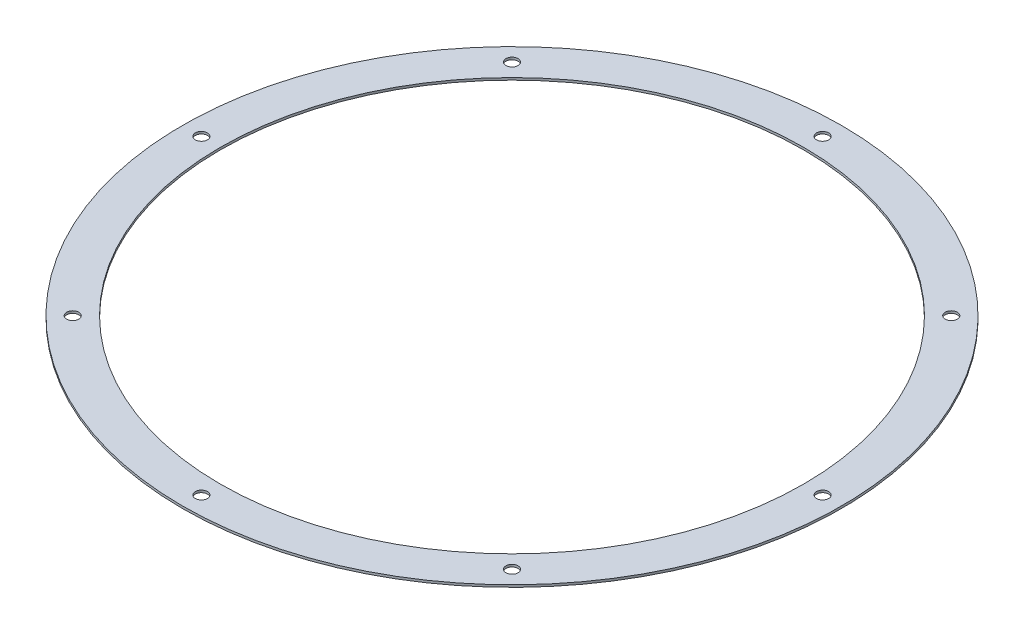
ISO-10303-21;
HEADER;
FILE_DESCRIPTION(('STEP AP214'),'2;1');
FILE_NAME('part.step','',(''),(''),'','','');
FILE_SCHEMA(('AUTOMOTIVE_DESIGN { 1 0 10303 214 1 1 1 1 }'));
ENDSEC;
DATA;
#1=APPLICATION_CONTEXT('core data for automotive mechanical design processes');
#2=APPLICATION_PROTOCOL_DEFINITION('international standard','automotive_design',2000,#1);
#3=PRODUCT_CONTEXT('',#1,'mechanical');
#4=PRODUCT('Part','Part','',(#3));
#5=PRODUCT_RELATED_PRODUCT_CATEGORY('part','',(#4));
#6=PRODUCT_DEFINITION_FORMATION('','',#4);
#7=PRODUCT_DEFINITION_CONTEXT('part definition',#1,'design');
#8=PRODUCT_DEFINITION('design','',#6,#7);
#9=PRODUCT_DEFINITION_SHAPE('','',#8);
#10=(LENGTH_UNIT() NAMED_UNIT(*) SI_UNIT(.MILLI.,.METRE.));
#11=(NAMED_UNIT(*) PLANE_ANGLE_UNIT() SI_UNIT($,.RADIAN.));
#12=(NAMED_UNIT(*) SI_UNIT($,.STERADIAN.) SOLID_ANGLE_UNIT());
#13=UNCERTAINTY_MEASURE_WITH_UNIT(LENGTH_MEASURE(1.E-05),#10,'distance_accuracy_value','');
#14=(GEOMETRIC_REPRESENTATION_CONTEXT(3) GLOBAL_UNCERTAINTY_ASSIGNED_CONTEXT((#13)) GLOBAL_UNIT_ASSIGNED_CONTEXT((#10,
#11,#12)) REPRESENTATION_CONTEXT('',''));
#15=CARTESIAN_POINT('',(0.,0.,0.));
#16=DIRECTION('',(0.,0.,1.));
#17=DIRECTION('',(1.,0.,0.));
#18=AXIS2_PLACEMENT_3D('',#15,#16,#17);
#19=CARTESIAN_POINT('',(0.,1.5,0.));
#20=DIRECTION('',(0.,1.,0.));
#21=DIRECTION('',(0.,0.,1.));
#22=AXIS2_PLACEMENT_3D('',#19,#20,#21);
#23=PLANE('',#22);
#24=CARTESIAN_POINT('',(410.,1.5,0.));
#25=DIRECTION('',(0.,1.,0.));
#26=DIRECTION('',(0.,0.,1.));
#27=AXIS2_PLACEMENT_3D('',#24,#25,#26);
#28=CIRCLE('',#27,7.99999999999998);
#29=CARTESIAN_POINT('',(410.,1.5,7.99999999999998));
#30=VERTEX_POINT('',#29);
#31=EDGE_CURVE('E96',#30,#30,#28,.T.);
#32=ORIENTED_EDGE('',*,*,#31,.F.);
#33=EDGE_LOOP('',(#32));
#34=FACE_BOUND('',#33,.T.);
#35=CARTESIAN_POINT('',(289.913780286484,1.5,289.913780286484));
#36=DIRECTION('',(0.,1.,0.));
#37=DIRECTION('',(0.,0.,1.));
#38=AXIS2_PLACEMENT_3D('',#35,#36,#37);
#39=CIRCLE('',#38,7.99999999999993);
#40=CARTESIAN_POINT('',(289.913780286484,1.5,297.913780286484));
#41=VERTEX_POINT('',#40);
#42=EDGE_CURVE('E93',#41,#41,#39,.T.);
#43=ORIENTED_EDGE('',*,*,#42,.F.);
#44=EDGE_LOOP('',(#43));
#45=FACE_BOUND('',#44,.T.);
#46=CARTESIAN_POINT('',(0.,1.5,410.));
#47=DIRECTION('',(0.,1.,0.));
#48=DIRECTION('',(0.,0.,1.));
#49=AXIS2_PLACEMENT_3D('',#46,#47,#48);
#50=CIRCLE('',#49,7.99999999999999);
#51=CARTESIAN_POINT('',(0.,1.5,418.));
#52=VERTEX_POINT('',#51);
#53=EDGE_CURVE('E87',#52,#52,#50,.T.);
#54=ORIENTED_EDGE('',*,*,#53,.F.);
#55=EDGE_LOOP('',(#54));
#56=FACE_BOUND('',#55,.T.);
#57=CARTESIAN_POINT('',(-289.913780286484,1.5,289.913780286484));
#58=DIRECTION('',(0.,1.,0.));
#59=DIRECTION('',(0.,0.,1.));
#60=AXIS2_PLACEMENT_3D('',#57,#58,#59);
#61=CIRCLE('',#60,7.99999999999992);
#62=CARTESIAN_POINT('',(-289.913780286484,1.5,297.913780286484));
#63=VERTEX_POINT('',#62);
#64=EDGE_CURVE('E81',#63,#63,#61,.T.);
#65=ORIENTED_EDGE('',*,*,#64,.F.);
#66=EDGE_LOOP('',(#65));
#67=FACE_BOUND('',#66,.T.);
#68=CARTESIAN_POINT('',(-410.,1.5,0.));
#69=DIRECTION('',(0.,1.,0.));
#70=DIRECTION('',(0.,0.,1.));
#71=AXIS2_PLACEMENT_3D('',#68,#69,#70);
#72=CIRCLE('',#71,7.99999999999993);
#73=CARTESIAN_POINT('',(-410.,1.5,7.99999999999998));
#74=VERTEX_POINT('',#73);
#75=EDGE_CURVE('E75',#74,#74,#72,.T.);
#76=ORIENTED_EDGE('',*,*,#75,.F.);
#77=EDGE_LOOP('',(#76));
#78=FACE_BOUND('',#77,.T.);
#79=CARTESIAN_POINT('',(-289.913780286484,1.5,-289.913780286484));
#80=DIRECTION('',(0.,1.,0.));
#81=DIRECTION('',(0.,0.,1.));
#82=AXIS2_PLACEMENT_3D('',#79,#80,#81);
#83=CIRCLE('',#82,7.99999999999993);
#84=CARTESIAN_POINT('',(-289.913780286484,1.5,-281.913780286484));
#85=VERTEX_POINT('',#84);
#86=EDGE_CURVE('E69',#85,#85,#83,.T.);
#87=ORIENTED_EDGE('',*,*,#86,.F.);
#88=EDGE_LOOP('',(#87));
#89=FACE_BOUND('',#88,.T.);
#90=CARTESIAN_POINT('',(0.,1.5,-410.));
#91=DIRECTION('',(0.,1.,0.));
#92=DIRECTION('',(0.,0.,1.));
#93=AXIS2_PLACEMENT_3D('',#90,#91,#92);
#94=CIRCLE('',#93,7.99999999999997);
#95=CARTESIAN_POINT('',(0.,1.5,-402.));
#96=VERTEX_POINT('',#95);
#97=EDGE_CURVE('E63',#96,#96,#94,.T.);
#98=ORIENTED_EDGE('',*,*,#97,.F.);
#99=EDGE_LOOP('',(#98));
#100=FACE_BOUND('',#99,.T.);
#101=CARTESIAN_POINT('',(289.913780286484,1.5,-289.913780286484));
#102=DIRECTION('',(0.,1.,0.));
#103=DIRECTION('',(0.,0.,1.));
#104=AXIS2_PLACEMENT_3D('',#101,#102,#103);
#105=CIRCLE('',#104,7.99999999999999);
#106=CARTESIAN_POINT('',(289.913780286484,1.5,-281.913780286484));
#107=VERTEX_POINT('',#106);
#108=EDGE_CURVE('E57',#107,#107,#105,.T.);
#109=ORIENTED_EDGE('',*,*,#108,.F.);
#110=EDGE_LOOP('',(#109));
#111=FACE_BOUND('',#110,.T.);
#112=CARTESIAN_POINT('',(0.,1.5,0.));
#113=DIRECTION('',(0.,1.,0.));
#114=DIRECTION('',(0.,0.,1.));
#115=AXIS2_PLACEMENT_3D('',#112,#113,#114);
#116=CIRCLE('',#115,435.);
#117=CARTESIAN_POINT('',(0.,1.5,435.));
#118=VERTEX_POINT('',#117);
#119=EDGE_CURVE('E10',#118,#118,#116,.T.);
#120=ORIENTED_EDGE('',*,*,#119,.T.);
#121=EDGE_LOOP('',(#120));
#122=FACE_BOUND('',#121,.T.);
#123=CARTESIAN_POINT('',(0.,1.5,0.));
#124=DIRECTION('',(0.,1.,0.));
#125=DIRECTION('',(0.,0.,1.));
#126=AXIS2_PLACEMENT_3D('',#123,#124,#125);
#127=CIRCLE('',#126,385.);
#128=CARTESIAN_POINT('',(0.,1.5,385.));
#129=VERTEX_POINT('',#128);
#130=EDGE_CURVE('E46',#129,#129,#127,.T.);
#131=ORIENTED_EDGE('',*,*,#130,.F.);
#132=EDGE_LOOP('',(#131));
#133=FACE_BOUND('',#132,.T.);
#134=ADVANCED_FACE('F35',(#34,#45,#56,#67,#78,#89,#100,#111,#122,#133),#23,.T.);
#135=CARTESIAN_POINT('',(0.,-1.5,0.));
#136=DIRECTION('',(0.,1.,0.));
#137=DIRECTION('',(0.,0.,1.));
#138=AXIS2_PLACEMENT_3D('',#135,#136,#137);
#139=PLANE('',#138);
#140=CARTESIAN_POINT('',(410.,-1.5,0.));
#141=DIRECTION('',(0.,1.,0.));
#142=DIRECTION('',(0.,0.,1.));
#143=AXIS2_PLACEMENT_3D('',#140,#141,#142);
#144=CIRCLE('',#143,7.99999999999998);
#145=CARTESIAN_POINT('',(410.,-1.5,7.99999999999998));
#146=VERTEX_POINT('',#145);
#147=EDGE_CURVE('E51',#146,#146,#144,.T.);
#148=ORIENTED_EDGE('',*,*,#147,.T.);
#149=EDGE_LOOP('',(#148));
#150=FACE_BOUND('',#149,.T.);
#151=CARTESIAN_POINT('',(289.913780286484,-1.5,289.913780286484));
#152=DIRECTION('',(0.,1.,0.));
#153=DIRECTION('',(0.,0.,1.));
#154=AXIS2_PLACEMENT_3D('',#151,#152,#153);
#155=CIRCLE('',#154,7.99999999999993);
#156=CARTESIAN_POINT('',(289.913780286484,-1.5,297.913780286484));
#157=VERTEX_POINT('',#156);
#158=EDGE_CURVE('E90',#157,#157,#155,.T.);
#159=ORIENTED_EDGE('',*,*,#158,.T.);
#160=EDGE_LOOP('',(#159));
#161=FACE_BOUND('',#160,.T.);
#162=CARTESIAN_POINT('',(0.,-1.5,410.));
#163=DIRECTION('',(0.,1.,0.));
#164=DIRECTION('',(0.,0.,1.));
#165=AXIS2_PLACEMENT_3D('',#162,#163,#164);
#166=CIRCLE('',#165,7.99999999999999);
#167=CARTESIAN_POINT('',(0.,-1.5,418.));
#168=VERTEX_POINT('',#167);
#169=EDGE_CURVE('E84',#168,#168,#166,.T.);
#170=ORIENTED_EDGE('',*,*,#169,.T.);
#171=EDGE_LOOP('',(#170));
#172=FACE_BOUND('',#171,.T.);
#173=CARTESIAN_POINT('',(-289.913780286484,-1.5,289.913780286484));
#174=DIRECTION('',(0.,1.,0.));
#175=DIRECTION('',(0.,0.,1.));
#176=AXIS2_PLACEMENT_3D('',#173,#174,#175);
#177=CIRCLE('',#176,7.99999999999992);
#178=CARTESIAN_POINT('',(-289.913780286484,-1.5,297.913780286484));
#179=VERTEX_POINT('',#178);
#180=EDGE_CURVE('E78',#179,#179,#177,.T.);
#181=ORIENTED_EDGE('',*,*,#180,.T.);
#182=EDGE_LOOP('',(#181));
#183=FACE_BOUND('',#182,.T.);
#184=CARTESIAN_POINT('',(-410.,-1.5,0.));
#185=DIRECTION('',(0.,1.,0.));
#186=DIRECTION('',(0.,0.,1.));
#187=AXIS2_PLACEMENT_3D('',#184,#185,#186);
#188=CIRCLE('',#187,7.99999999999993);
#189=CARTESIAN_POINT('',(-410.,-1.5,7.99999999999998));
#190=VERTEX_POINT('',#189);
#191=EDGE_CURVE('E72',#190,#190,#188,.T.);
#192=ORIENTED_EDGE('',*,*,#191,.T.);
#193=EDGE_LOOP('',(#192));
#194=FACE_BOUND('',#193,.T.);
#195=CARTESIAN_POINT('',(-289.913780286484,-1.5,-289.913780286484));
#196=DIRECTION('',(0.,1.,0.));
#197=DIRECTION('',(0.,0.,1.));
#198=AXIS2_PLACEMENT_3D('',#195,#196,#197);
#199=CIRCLE('',#198,7.99999999999993);
#200=CARTESIAN_POINT('',(-289.913780286484,-1.5,-281.913780286484));
#201=VERTEX_POINT('',#200);
#202=EDGE_CURVE('E66',#201,#201,#199,.T.);
#203=ORIENTED_EDGE('',*,*,#202,.T.);
#204=EDGE_LOOP('',(#203));
#205=FACE_BOUND('',#204,.T.);
#206=CARTESIAN_POINT('',(0.,-1.5,-410.));
#207=DIRECTION('',(0.,1.,0.));
#208=DIRECTION('',(0.,0.,1.));
#209=AXIS2_PLACEMENT_3D('',#206,#207,#208);
#210=CIRCLE('',#209,7.99999999999997);
#211=CARTESIAN_POINT('',(0.,-1.5,-402.));
#212=VERTEX_POINT('',#211);
#213=EDGE_CURVE('E60',#212,#212,#210,.T.);
#214=ORIENTED_EDGE('',*,*,#213,.T.);
#215=EDGE_LOOP('',(#214));
#216=FACE_BOUND('',#215,.T.);
#217=CARTESIAN_POINT('',(289.913780286484,-1.5,-289.913780286484));
#218=DIRECTION('',(0.,1.,0.));
#219=DIRECTION('',(0.,0.,1.));
#220=AXIS2_PLACEMENT_3D('',#217,#218,#219);
#221=CIRCLE('',#220,7.99999999999999);
#222=CARTESIAN_POINT('',(289.913780286484,-1.5,-281.913780286484));
#223=VERTEX_POINT('',#222);
#224=EDGE_CURVE('E54',#223,#223,#221,.T.);
#225=ORIENTED_EDGE('',*,*,#224,.T.);
#226=EDGE_LOOP('',(#225));
#227=FACE_BOUND('',#226,.T.);
#228=CARTESIAN_POINT('',(0.,-1.5,0.));
#229=DIRECTION('',(0.,1.,0.));
#230=DIRECTION('',(0.,0.,1.));
#231=AXIS2_PLACEMENT_3D('',#228,#229,#230);
#232=CIRCLE('',#231,435.);
#233=CARTESIAN_POINT('',(0.,-1.5,435.));
#234=VERTEX_POINT('',#233);
#235=EDGE_CURVE('E39',#234,#234,#232,.T.);
#236=ORIENTED_EDGE('',*,*,#235,.F.);
#237=EDGE_LOOP('',(#236));
#238=FACE_BOUND('',#237,.T.);
#239=CARTESIAN_POINT('',(0.,-1.5,0.));
#240=DIRECTION('',(0.,1.,0.));
#241=DIRECTION('',(0.,0.,1.));
#242=AXIS2_PLACEMENT_3D('',#239,#240,#241);
#243=CIRCLE('',#242,385.);
#244=CARTESIAN_POINT('',(0.,-1.5,385.));
#245=VERTEX_POINT('',#244);
#246=EDGE_CURVE('E48',#245,#245,#243,.T.);
#247=ORIENTED_EDGE('',*,*,#246,.T.);
#248=EDGE_LOOP('',(#247));
#249=FACE_BOUND('',#248,.T.);
#250=ADVANCED_FACE('F102',(#150,#161,#172,#183,#194,#205,#216,#227,#238,#249),#139,.F.);
#251=CARTESIAN_POINT('',(0.,1.5,0.));
#252=DIRECTION('',(0.,-1.,0.));
#253=DIRECTION('',(0.,0.,-1.));
#254=AXIS2_PLACEMENT_3D('',#251,#252,#253);
#255=CYLINDRICAL_SURFACE('',#254,435.);
#256=ORIENTED_EDGE('',*,*,#119,.F.);
#257=EDGE_LOOP('',(#256));
#258=FACE_BOUND('',#257,.T.);
#259=ORIENTED_EDGE('',*,*,#235,.T.);
#260=EDGE_LOOP('',(#259));
#261=FACE_BOUND('',#260,.T.);
#262=ADVANCED_FACE('F37',(#258,#261),#255,.T.);
#263=CARTESIAN_POINT('',(0.,1.5,0.));
#264=DIRECTION('',(0.,-1.,0.));
#265=DIRECTION('',(0.,0.,-1.));
#266=AXIS2_PLACEMENT_3D('',#263,#264,#265);
#267=CYLINDRICAL_SURFACE('',#266,385.);
#268=ORIENTED_EDGE('',*,*,#130,.T.);
#269=EDGE_LOOP('',(#268));
#270=FACE_BOUND('',#269,.T.);
#271=ORIENTED_EDGE('',*,*,#246,.F.);
#272=EDGE_LOOP('',(#271));
#273=FACE_BOUND('',#272,.T.);
#274=ADVANCED_FACE('F131',(#270,#273),#267,.F.);
#275=CARTESIAN_POINT('',(289.913780286484,-1.5,-289.913780286484));
#276=DIRECTION('',(0.,1.,0.));
#277=DIRECTION('',(0.,0.,1.));
#278=AXIS2_PLACEMENT_3D('',#275,#276,#277);
#279=CYLINDRICAL_SURFACE('',#278,7.99999999999999);
#280=ORIENTED_EDGE('',*,*,#224,.F.);
#281=EDGE_LOOP('',(#280));
#282=FACE_BOUND('',#281,.T.);
#283=ORIENTED_EDGE('',*,*,#108,.T.);
#284=EDGE_LOOP('',(#283));
#285=FACE_BOUND('',#284,.T.);
#286=ADVANCED_FACE('F134',(#282,#285),#279,.F.);
#287=CARTESIAN_POINT('',(0.,-1.5,-410.));
#288=DIRECTION('',(0.,1.,0.));
#289=DIRECTION('',(0.,0.,1.));
#290=AXIS2_PLACEMENT_3D('',#287,#288,#289);
#291=CYLINDRICAL_SURFACE('',#290,7.99999999999997);
#292=ORIENTED_EDGE('',*,*,#213,.F.);
#293=EDGE_LOOP('',(#292));
#294=FACE_BOUND('',#293,.T.);
#295=ORIENTED_EDGE('',*,*,#97,.T.);
#296=EDGE_LOOP('',(#295));
#297=FACE_BOUND('',#296,.T.);
#298=ADVANCED_FACE('F146',(#294,#297),#291,.F.);
#299=CARTESIAN_POINT('',(-289.913780286484,-1.5,-289.913780286484));
#300=DIRECTION('',(0.,1.,0.));
#301=DIRECTION('',(0.,0.,1.));
#302=AXIS2_PLACEMENT_3D('',#299,#300,#301);
#303=CYLINDRICAL_SURFACE('',#302,7.99999999999993);
#304=ORIENTED_EDGE('',*,*,#202,.F.);
#305=EDGE_LOOP('',(#304));
#306=FACE_BOUND('',#305,.T.);
#307=ORIENTED_EDGE('',*,*,#86,.T.);
#308=EDGE_LOOP('',(#307));
#309=FACE_BOUND('',#308,.T.);
#310=ADVANCED_FACE('F150',(#306,#309),#303,.F.);
#311=CARTESIAN_POINT('',(-410.,-1.5,0.));
#312=DIRECTION('',(0.,1.,0.));
#313=DIRECTION('',(0.,0.,1.));
#314=AXIS2_PLACEMENT_3D('',#311,#312,#313);
#315=CYLINDRICAL_SURFACE('',#314,7.99999999999993);
#316=ORIENTED_EDGE('',*,*,#191,.F.);
#317=EDGE_LOOP('',(#316));
#318=FACE_BOUND('',#317,.T.);
#319=ORIENTED_EDGE('',*,*,#75,.T.);
#320=EDGE_LOOP('',(#319));
#321=FACE_BOUND('',#320,.T.);
#322=ADVANCED_FACE('F154',(#318,#321),#315,.F.);
#323=CARTESIAN_POINT('',(-289.913780286484,-1.5,289.913780286484));
#324=DIRECTION('',(0.,1.,0.));
#325=DIRECTION('',(0.,0.,1.));
#326=AXIS2_PLACEMENT_3D('',#323,#324,#325);
#327=CYLINDRICAL_SURFACE('',#326,7.99999999999992);
#328=ORIENTED_EDGE('',*,*,#180,.F.);
#329=EDGE_LOOP('',(#328));
#330=FACE_BOUND('',#329,.T.);
#331=ORIENTED_EDGE('',*,*,#64,.T.);
#332=EDGE_LOOP('',(#331));
#333=FACE_BOUND('',#332,.T.);
#334=ADVANCED_FACE('F158',(#330,#333),#327,.F.);
#335=CARTESIAN_POINT('',(0.,-1.5,410.));
#336=DIRECTION('',(0.,1.,0.));
#337=DIRECTION('',(0.,0.,1.));
#338=AXIS2_PLACEMENT_3D('',#335,#336,#337);
#339=CYLINDRICAL_SURFACE('',#338,7.99999999999999);
#340=ORIENTED_EDGE('',*,*,#169,.F.);
#341=EDGE_LOOP('',(#340));
#342=FACE_BOUND('',#341,.T.);
#343=ORIENTED_EDGE('',*,*,#53,.T.);
#344=EDGE_LOOP('',(#343));
#345=FACE_BOUND('',#344,.T.);
#346=ADVANCED_FACE('F162',(#342,#345),#339,.F.);
#347=CARTESIAN_POINT('',(289.913780286484,-1.5,289.913780286484));
#348=DIRECTION('',(0.,1.,0.));
#349=DIRECTION('',(0.,0.,1.));
#350=AXIS2_PLACEMENT_3D('',#347,#348,#349);
#351=CYLINDRICAL_SURFACE('',#350,7.99999999999993);
#352=ORIENTED_EDGE('',*,*,#158,.F.);
#353=EDGE_LOOP('',(#352));
#354=FACE_BOUND('',#353,.T.);
#355=ORIENTED_EDGE('',*,*,#42,.T.);
#356=EDGE_LOOP('',(#355));
#357=FACE_BOUND('',#356,.T.);
#358=ADVANCED_FACE('F108',(#354,#357),#351,.F.);
#359=CARTESIAN_POINT('',(410.,-1.5,0.));
#360=DIRECTION('',(0.,1.,0.));
#361=DIRECTION('',(0.,0.,1.));
#362=AXIS2_PLACEMENT_3D('',#359,#360,#361);
#363=CYLINDRICAL_SURFACE('',#362,7.99999999999998);
#364=ORIENTED_EDGE('',*,*,#147,.F.);
#365=EDGE_LOOP('',(#364));
#366=FACE_BOUND('',#365,.T.);
#367=ORIENTED_EDGE('',*,*,#31,.T.);
#368=EDGE_LOOP('',(#367));
#369=FACE_BOUND('',#368,.T.);
#370=ADVANCED_FACE('F105',(#366,#369),#363,.F.);
#371=CLOSED_SHELL('',(#134,#250,#262,#274,#286,#298,#310,#322,#334,#346,#358,#370));
#372=MANIFOLD_SOLID_BREP('B2',#371);
#373=ADVANCED_BREP_SHAPE_REPRESENTATION('',(#18,#372),#14);
#374=SHAPE_DEFINITION_REPRESENTATION(#9,#373);
ENDSEC;
END-ISO-10303-21;
